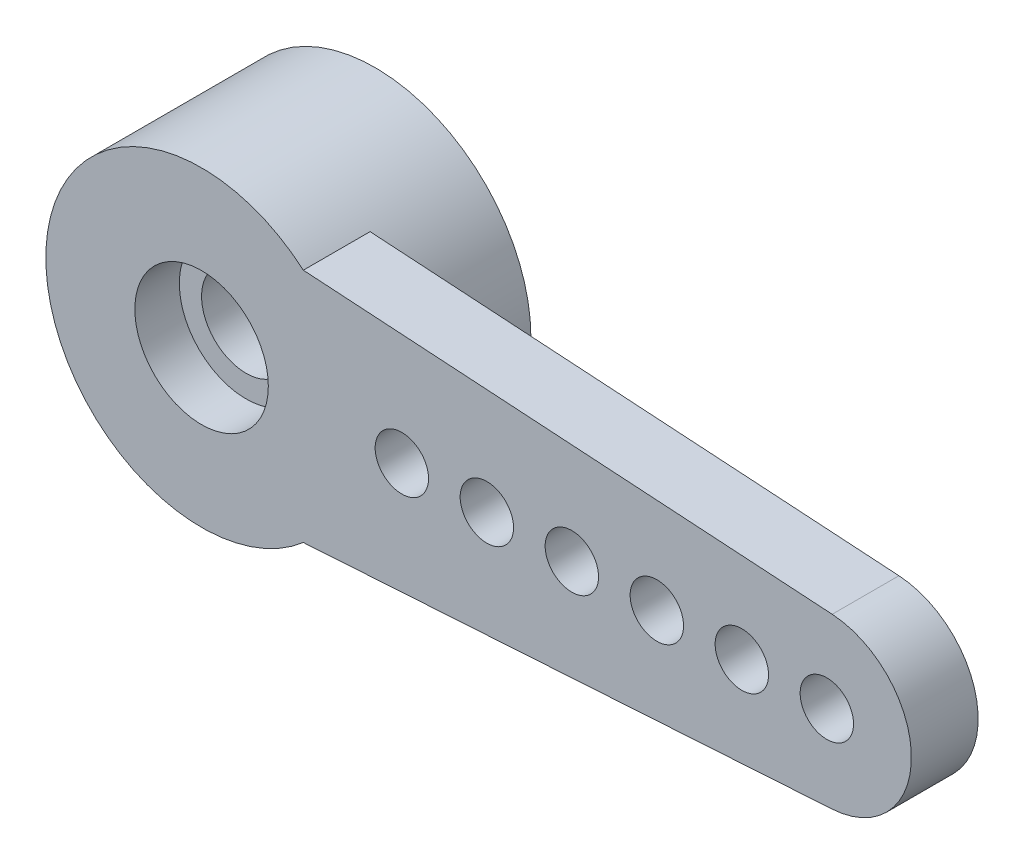
ISO-10303-21;
HEADER;
FILE_DESCRIPTION(('STEP AP214'),'2;1');
FILE_NAME('part.step','',(''),(''),'','','');
FILE_SCHEMA(('AUTOMOTIVE_DESIGN { 1 0 10303 214 1 1 1 1 }'));
ENDSEC;
DATA;
#1=APPLICATION_CONTEXT('core data for automotive mechanical design processes');
#2=APPLICATION_PROTOCOL_DEFINITION('international standard','automotive_design',2000,#1);
#3=PRODUCT_CONTEXT('',#1,'mechanical');
#4=PRODUCT('Part','Part','',(#3));
#5=PRODUCT_RELATED_PRODUCT_CATEGORY('part','',(#4));
#6=PRODUCT_DEFINITION_FORMATION('','',#4);
#7=PRODUCT_DEFINITION_CONTEXT('part definition',#1,'design');
#8=PRODUCT_DEFINITION('design','',#6,#7);
#9=PRODUCT_DEFINITION_SHAPE('','',#8);
#10=(LENGTH_UNIT() NAMED_UNIT(*) SI_UNIT(.MILLI.,.METRE.));
#11=(NAMED_UNIT(*) PLANE_ANGLE_UNIT() SI_UNIT($,.RADIAN.));
#12=(NAMED_UNIT(*) SI_UNIT($,.STERADIAN.) SOLID_ANGLE_UNIT());
#13=UNCERTAINTY_MEASURE_WITH_UNIT(LENGTH_MEASURE(1.E-05),#10,'distance_accuracy_value','');
#14=(GEOMETRIC_REPRESENTATION_CONTEXT(3) GLOBAL_UNCERTAINTY_ASSIGNED_CONTEXT((#13)) GLOBAL_UNIT_ASSIGNED_CONTEXT((#10,
#11,#12)) REPRESENTATION_CONTEXT('',''));
#15=CARTESIAN_POINT('',(0.,0.,0.));
#16=DIRECTION('',(0.,0.,1.));
#17=DIRECTION('',(1.,0.,0.));
#18=AXIS2_PLACEMENT_3D('',#15,#16,#17);
#19=CARTESIAN_POINT('',(0.,0.,3.9));
#20=DIRECTION('',(0.,0.,-1.));
#21=DIRECTION('',(-1.,0.,0.));
#22=AXIS2_PLACEMENT_3D('',#19,#20,#21);
#23=CYLINDRICAL_SURFACE('',#22,3.5);
#24=CARTESIAN_POINT('',(0.,0.,3.9));
#25=DIRECTION('',(0.,0.,1.));
#26=DIRECTION('',(1.,0.,0.));
#27=AXIS2_PLACEMENT_3D('',#24,#25,#26);
#28=CIRCLE('',#27,3.5);
#29=CARTESIAN_POINT('',(2.28637267303474,2.65,3.9));
#30=VERTEX_POINT('',#29);
#31=CARTESIAN_POINT('',(2.28637267303473,-2.65,3.9));
#32=VERTEX_POINT('',#31);
#33=EDGE_CURVE('E12',#30,#32,#28,.T.);
#34=ORIENTED_EDGE('',*,*,#33,.F.);
#35=DIRECTION('',(0.,0.,1.));
#36=VECTOR('',#35,1.);
#37=CARTESIAN_POINT('',(2.28637267303474,2.65,2.4));
#38=LINE('',#37,#36);
#39=CARTESIAN_POINT('',(2.28637267303474,2.65,2.4));
#40=VERTEX_POINT('',#39);
#41=EDGE_CURVE('E188',#40,#30,#38,.T.);
#42=ORIENTED_EDGE('',*,*,#41,.F.);
#43=CARTESIAN_POINT('',(0.,0.,2.4));
#44=DIRECTION('',(0.,0.,1.));
#45=DIRECTION('',(1.,0.,0.));
#46=AXIS2_PLACEMENT_3D('',#43,#44,#45);
#47=CIRCLE('',#46,3.5);
#48=CARTESIAN_POINT('',(2.28637267303473,-2.65,2.4));
#49=VERTEX_POINT('',#48);
#50=EDGE_CURVE('E174',#49,#40,#47,.T.);
#51=ORIENTED_EDGE('',*,*,#50,.F.);
#52=DIRECTION('',(0.,0.,1.));
#53=VECTOR('',#52,1.);
#54=CARTESIAN_POINT('',(2.28637267303473,-2.65,2.4));
#55=LINE('',#54,#53);
#56=EDGE_CURVE('E179',#49,#32,#55,.T.);
#57=ORIENTED_EDGE('',*,*,#56,.T.);
#58=EDGE_LOOP('',(#34,#42,#51,#57));
#59=FACE_BOUND('',#58,.T.);
#60=CARTESIAN_POINT('',(0.,0.,0.));
#61=DIRECTION('',(0.,0.,1.));
#62=DIRECTION('',(1.,0.,0.));
#63=AXIS2_PLACEMENT_3D('',#60,#61,#62);
#64=CIRCLE('',#63,3.5);
#65=CARTESIAN_POINT('',(3.5,0.,0.));
#66=VERTEX_POINT('',#65);
#67=EDGE_CURVE('E137',#66,#66,#64,.T.);
#68=ORIENTED_EDGE('',*,*,#67,.T.);
#69=EDGE_LOOP('',(#68));
#70=FACE_BOUND('',#69,.T.);
#71=ADVANCED_FACE('F129',(#59,#70),#23,.T.);
#72=CARTESIAN_POINT('',(0.,0.,3.9));
#73=DIRECTION('',(0.,0.,1.));
#74=DIRECTION('',(1.,0.,0.));
#75=AXIS2_PLACEMENT_3D('',#72,#73,#74);
#76=PLANE('',#75);
#77=CARTESIAN_POINT('',(0.,0.,3.9));
#78=DIRECTION('',(0.,0.,1.));
#79=DIRECTION('',(1.,0.,0.));
#80=AXIS2_PLACEMENT_3D('',#77,#78,#79);
#81=CIRCLE('',#80,1.5);
#82=CARTESIAN_POINT('',(1.5,0.,3.9));
#83=VERTEX_POINT('',#82);
#84=EDGE_CURVE('E482',#83,#83,#81,.T.);
#85=ORIENTED_EDGE('',*,*,#84,.F.);
#86=EDGE_LOOP('',(#85));
#87=FACE_BOUND('',#86,.T.);
#88=ORIENTED_EDGE('',*,*,#33,.T.);
#89=DIRECTION('',(0.99799428926586,0.0633040171926834,0.));
#90=VECTOR('',#89,1.);
#91=CARTESIAN_POINT('',(0.176581582893977,-2.78382666902983,3.9));
#92=LINE('',#91,#90);
#93=CARTESIAN_POINT('',(14.1702776326661,-1.89618914960513,3.9));
#94=VERTEX_POINT('',#93);
#95=EDGE_CURVE('E184',#32,#94,#92,.T.);
#96=ORIENTED_EDGE('',*,*,#95,.T.);
#97=CARTESIAN_POINT('',(14.05,0.,3.9));
#98=DIRECTION('',(0.,0.,1.));
#99=DIRECTION('',(1.,0.,0.));
#100=AXIS2_PLACEMENT_3D('',#97,#98,#99);
#101=CIRCLE('',#100,1.9);
#102=CARTESIAN_POINT('',(14.1702776326661,1.89618914960513,3.9));
#103=VERTEX_POINT('',#102);
#104=EDGE_CURVE('E197',#94,#103,#101,.T.);
#105=ORIENTED_EDGE('',*,*,#104,.T.);
#106=DIRECTION('',(-0.99799428926586,0.0633040171926833,0.));
#107=VECTOR('',#106,1.);
#108=CARTESIAN_POINT('',(0.176581582893976,2.78382666902983,3.9));
#109=LINE('',#108,#107);
#110=EDGE_CURVE('E144',#103,#30,#109,.T.);
#111=ORIENTED_EDGE('',*,*,#110,.T.);
#112=EDGE_LOOP('',(#88,#96,#105,#111));
#113=FACE_BOUND('',#112,.T.);
#114=CARTESIAN_POINT('',(14.05,0.,3.9));
#115=DIRECTION('',(0.,0.,1.));
#116=DIRECTION('',(1.,0.,0.));
#117=AXIS2_PLACEMENT_3D('',#114,#115,#116);
#118=CIRCLE('',#117,0.6);
#119=CARTESIAN_POINT('',(14.65,0.,3.9));
#120=VERTEX_POINT('',#119);
#121=EDGE_CURVE('E432',#120,#120,#118,.T.);
#122=ORIENTED_EDGE('',*,*,#121,.F.);
#123=EDGE_LOOP('',(#122));
#124=FACE_BOUND('',#123,.T.);
#125=CARTESIAN_POINT('',(12.14,0.,3.9));
#126=DIRECTION('',(0.,0.,1.));
#127=DIRECTION('',(1.,0.,0.));
#128=AXIS2_PLACEMENT_3D('',#125,#126,#127);
#129=CIRCLE('',#128,0.6);
#130=CARTESIAN_POINT('',(12.74,0.,3.9));
#131=VERTEX_POINT('',#130);
#132=EDGE_CURVE('E436',#131,#131,#129,.T.);
#133=ORIENTED_EDGE('',*,*,#132,.F.);
#134=EDGE_LOOP('',(#133));
#135=FACE_BOUND('',#134,.T.);
#136=CARTESIAN_POINT('',(10.23,0.,3.9));
#137=DIRECTION('',(0.,0.,1.));
#138=DIRECTION('',(1.,0.,0.));
#139=AXIS2_PLACEMENT_3D('',#136,#137,#138);
#140=CIRCLE('',#139,0.6);
#141=CARTESIAN_POINT('',(10.83,0.,3.9));
#142=VERTEX_POINT('',#141);
#143=EDGE_CURVE('E440',#142,#142,#140,.T.);
#144=ORIENTED_EDGE('',*,*,#143,.F.);
#145=EDGE_LOOP('',(#144));
#146=FACE_BOUND('',#145,.T.);
#147=CARTESIAN_POINT('',(8.32,0.,3.9));
#148=DIRECTION('',(0.,0.,1.));
#149=DIRECTION('',(1.,0.,0.));
#150=AXIS2_PLACEMENT_3D('',#147,#148,#149);
#151=CIRCLE('',#150,0.6);
#152=CARTESIAN_POINT('',(8.92,0.,3.9));
#153=VERTEX_POINT('',#152);
#154=EDGE_CURVE('E444',#153,#153,#151,.T.);
#155=ORIENTED_EDGE('',*,*,#154,.F.);
#156=EDGE_LOOP('',(#155));
#157=FACE_BOUND('',#156,.T.);
#158=CARTESIAN_POINT('',(6.41,0.,3.9));
#159=DIRECTION('',(0.,0.,1.));
#160=DIRECTION('',(1.,0.,0.));
#161=AXIS2_PLACEMENT_3D('',#158,#159,#160);
#162=CIRCLE('',#161,0.6);
#163=CARTESIAN_POINT('',(7.01,0.,3.9));
#164=VERTEX_POINT('',#163);
#165=EDGE_CURVE('E448',#164,#164,#162,.T.);
#166=ORIENTED_EDGE('',*,*,#165,.F.);
#167=EDGE_LOOP('',(#166));
#168=FACE_BOUND('',#167,.T.);
#169=CARTESIAN_POINT('',(4.5,0.,3.9));
#170=DIRECTION('',(0.,0.,1.));
#171=DIRECTION('',(1.,0.,0.));
#172=AXIS2_PLACEMENT_3D('',#169,#170,#171);
#173=CIRCLE('',#172,0.6);
#174=CARTESIAN_POINT('',(5.1,0.,3.9));
#175=VERTEX_POINT('',#174);
#176=EDGE_CURVE('E451',#175,#175,#173,.T.);
#177=ORIENTED_EDGE('',*,*,#176,.F.);
#178=EDGE_LOOP('',(#177));
#179=FACE_BOUND('',#178,.T.);
#180=ADVANCED_FACE('F214',(#87,#113,#124,#135,#146,#157,#168,#179),#76,.T.);
#181=CARTESIAN_POINT('',(0.,0.,0.));
#182=DIRECTION('',(0.,0.,1.));
#183=DIRECTION('',(1.,0.,0.));
#184=AXIS2_PLACEMENT_3D('',#181,#182,#183);
#185=PLANE('',#184);
#186=CARTESIAN_POINT('',(0.,0.,0.));
#187=DIRECTION('',(0.,0.,1.));
#188=DIRECTION('',(1.,0.,0.));
#189=AXIS2_PLACEMENT_3D('',#186,#187,#188);
#190=CIRCLE('',#189,2.5);
#191=CARTESIAN_POINT('',(2.5,0.,0.));
#192=VERTEX_POINT('',#191);
#193=EDGE_CURVE('E477',#192,#192,#190,.T.);
#194=ORIENTED_EDGE('',*,*,#193,.T.);
#195=EDGE_LOOP('',(#194));
#196=FACE_BOUND('',#195,.T.);
#197=ORIENTED_EDGE('',*,*,#67,.F.);
#198=EDGE_LOOP('',(#197));
#199=FACE_BOUND('',#198,.T.);
#200=ADVANCED_FACE('F211',(#196,#199),#185,.F.);
#201=CARTESIAN_POINT('',(0.176581582893976,2.78382666902983,2.4));
#202=DIRECTION('',(0.0633040171926833,0.99799428926586,0.));
#203=DIRECTION('',(-0.99799428926586,0.0633040171926833,0.));
#204=AXIS2_PLACEMENT_3D('',#201,#202,#203);
#205=PLANE('',#204);
#206=ORIENTED_EDGE('',*,*,#110,.F.);
#207=DIRECTION('',(0.,0.,1.));
#208=VECTOR('',#207,1.);
#209=CARTESIAN_POINT('',(14.1702776326661,1.89618914960513,2.4));
#210=LINE('',#209,#208);
#211=CARTESIAN_POINT('',(14.1702776326661,1.89618914960513,2.4));
#212=VERTEX_POINT('',#211);
#213=EDGE_CURVE('E152',#212,#103,#210,.T.);
#214=ORIENTED_EDGE('',*,*,#213,.F.);
#215=DIRECTION('',(-0.99799428926586,0.0633040171926833,0.));
#216=VECTOR('',#215,1.);
#217=CARTESIAN_POINT('',(0.176581582893976,2.78382666902983,2.4));
#218=LINE('',#217,#216);
#219=EDGE_CURVE('E195',#212,#40,#218,.T.);
#220=ORIENTED_EDGE('',*,*,#219,.T.);
#221=ORIENTED_EDGE('',*,*,#41,.T.);
#222=EDGE_LOOP('',(#206,#214,#220,#221));
#223=FACE_BOUND('',#222,.T.);
#224=ADVANCED_FACE('F213',(#223),#205,.T.);
#225=CARTESIAN_POINT('',(14.05,0.,2.4));
#226=DIRECTION('',(0.,0.,1.));
#227=DIRECTION('',(1.,0.,0.));
#228=AXIS2_PLACEMENT_3D('',#225,#226,#227);
#229=CYLINDRICAL_SURFACE('',#228,1.9);
#230=ORIENTED_EDGE('',*,*,#104,.F.);
#231=DIRECTION('',(0.,0.,1.));
#232=VECTOR('',#231,1.);
#233=CARTESIAN_POINT('',(14.1702776326661,-1.89618914960513,2.4));
#234=LINE('',#233,#232);
#235=CARTESIAN_POINT('',(14.1702776326661,-1.89618914960513,2.4));
#236=VERTEX_POINT('',#235);
#237=EDGE_CURVE('E187',#236,#94,#234,.T.);
#238=ORIENTED_EDGE('',*,*,#237,.F.);
#239=CARTESIAN_POINT('',(14.05,0.,2.4));
#240=DIRECTION('',(0.,0.,1.));
#241=DIRECTION('',(1.,0.,0.));
#242=AXIS2_PLACEMENT_3D('',#239,#240,#241);
#243=CIRCLE('',#242,1.9);
#244=EDGE_CURVE('E191',#236,#212,#243,.T.);
#245=ORIENTED_EDGE('',*,*,#244,.T.);
#246=ORIENTED_EDGE('',*,*,#213,.T.);
#247=EDGE_LOOP('',(#230,#238,#245,#246));
#248=FACE_BOUND('',#247,.T.);
#249=ADVANCED_FACE('F220',(#248),#229,.T.);
#250=CARTESIAN_POINT('',(0.176581582893977,-2.78382666902983,2.4));
#251=DIRECTION('',(0.0633040171926833,-0.99799428926586,0.));
#252=DIRECTION('',(0.99799428926586,0.0633040171926834,0.));
#253=AXIS2_PLACEMENT_3D('',#250,#251,#252);
#254=PLANE('',#253);
#255=ORIENTED_EDGE('',*,*,#95,.F.);
#256=ORIENTED_EDGE('',*,*,#56,.F.);
#257=DIRECTION('',(0.99799428926586,0.0633040171926834,0.));
#258=VECTOR('',#257,1.);
#259=CARTESIAN_POINT('',(0.176581582893977,-2.78382666902983,2.4));
#260=LINE('',#259,#258);
#261=EDGE_CURVE('E181',#49,#236,#260,.T.);
#262=ORIENTED_EDGE('',*,*,#261,.T.);
#263=ORIENTED_EDGE('',*,*,#237,.T.);
#264=EDGE_LOOP('',(#255,#256,#262,#263));
#265=FACE_BOUND('',#264,.T.);
#266=ADVANCED_FACE('F180',(#265),#254,.T.);
#267=CARTESIAN_POINT('',(0.,0.,2.4));
#268=DIRECTION('',(0.,0.,1.));
#269=DIRECTION('',(1.,0.,0.));
#270=AXIS2_PLACEMENT_3D('',#267,#268,#269);
#271=PLANE('',#270);
#272=CARTESIAN_POINT('',(14.05,0.,2.4));
#273=DIRECTION('',(0.,0.,1.));
#274=DIRECTION('',(1.,0.,0.));
#275=AXIS2_PLACEMENT_3D('',#272,#273,#274);
#276=CIRCLE('',#275,0.6);
#277=CARTESIAN_POINT('',(14.65,0.,2.4));
#278=VERTEX_POINT('',#277);
#279=EDGE_CURVE('E470',#278,#278,#276,.T.);
#280=ORIENTED_EDGE('',*,*,#279,.T.);
#281=EDGE_LOOP('',(#280));
#282=FACE_BOUND('',#281,.T.);
#283=CARTESIAN_POINT('',(12.14,0.,2.4));
#284=DIRECTION('',(0.,0.,1.));
#285=DIRECTION('',(1.,0.,0.));
#286=AXIS2_PLACEMENT_3D('',#283,#284,#285);
#287=CIRCLE('',#286,0.6);
#288=CARTESIAN_POINT('',(12.74,0.,2.4));
#289=VERTEX_POINT('',#288);
#290=EDGE_CURVE('E466',#289,#289,#287,.T.);
#291=ORIENTED_EDGE('',*,*,#290,.T.);
#292=EDGE_LOOP('',(#291));
#293=FACE_BOUND('',#292,.T.);
#294=CARTESIAN_POINT('',(10.23,0.,2.4));
#295=DIRECTION('',(0.,0.,1.));
#296=DIRECTION('',(1.,0.,0.));
#297=AXIS2_PLACEMENT_3D('',#294,#295,#296);
#298=CIRCLE('',#297,0.6);
#299=CARTESIAN_POINT('',(10.83,0.,2.4));
#300=VERTEX_POINT('',#299);
#301=EDGE_CURVE('E462',#300,#300,#298,.T.);
#302=ORIENTED_EDGE('',*,*,#301,.T.);
#303=EDGE_LOOP('',(#302));
#304=FACE_BOUND('',#303,.T.);
#305=CARTESIAN_POINT('',(8.32,0.,2.4));
#306=DIRECTION('',(0.,0.,1.));
#307=DIRECTION('',(1.,0.,0.));
#308=AXIS2_PLACEMENT_3D('',#305,#306,#307);
#309=CIRCLE('',#308,0.6);
#310=CARTESIAN_POINT('',(8.92,0.,2.4));
#311=VERTEX_POINT('',#310);
#312=EDGE_CURVE('E459',#311,#311,#309,.T.);
#313=ORIENTED_EDGE('',*,*,#312,.T.);
#314=EDGE_LOOP('',(#313));
#315=FACE_BOUND('',#314,.T.);
#316=CARTESIAN_POINT('',(6.41,0.,2.4));
#317=DIRECTION('',(0.,0.,1.));
#318=DIRECTION('',(1.,0.,0.));
#319=AXIS2_PLACEMENT_3D('',#316,#317,#318);
#320=CIRCLE('',#319,0.6);
#321=CARTESIAN_POINT('',(7.01,0.,2.4));
#322=VERTEX_POINT('',#321);
#323=EDGE_CURVE('E453',#322,#322,#320,.T.);
#324=ORIENTED_EDGE('',*,*,#323,.T.);
#325=EDGE_LOOP('',(#324));
#326=FACE_BOUND('',#325,.T.);
#327=CARTESIAN_POINT('',(4.5,0.,2.4));
#328=DIRECTION('',(0.,0.,1.));
#329=DIRECTION('',(1.,0.,0.));
#330=AXIS2_PLACEMENT_3D('',#327,#328,#329);
#331=CIRCLE('',#330,0.6);
#332=CARTESIAN_POINT('',(5.1,0.,2.4));
#333=VERTEX_POINT('',#332);
#334=EDGE_CURVE('E203',#333,#333,#331,.T.);
#335=ORIENTED_EDGE('',*,*,#334,.T.);
#336=EDGE_LOOP('',(#335));
#337=FACE_BOUND('',#336,.T.);
#338=ORIENTED_EDGE('',*,*,#219,.F.);
#339=ORIENTED_EDGE('',*,*,#244,.F.);
#340=ORIENTED_EDGE('',*,*,#261,.F.);
#341=ORIENTED_EDGE('',*,*,#50,.T.);
#342=EDGE_LOOP('',(#338,#339,#340,#341));
#343=FACE_BOUND('',#342,.T.);
#344=ADVANCED_FACE('F190',(#282,#293,#304,#315,#326,#337,#343),#271,.F.);
#345=CARTESIAN_POINT('',(4.5,0.,2.4));
#346=DIRECTION('',(0.,0.,1.));
#347=DIRECTION('',(1.,0.,0.));
#348=AXIS2_PLACEMENT_3D('',#345,#346,#347);
#349=CYLINDRICAL_SURFACE('',#348,0.6);
#350=ORIENTED_EDGE('',*,*,#334,.F.);
#351=EDGE_LOOP('',(#350));
#352=FACE_BOUND('',#351,.T.);
#353=ORIENTED_EDGE('',*,*,#176,.T.);
#354=EDGE_LOOP('',(#353));
#355=FACE_BOUND('',#354,.T.);
#356=ADVANCED_FACE('F344',(#352,#355),#349,.F.);
#357=CARTESIAN_POINT('',(6.41,0.,2.4));
#358=DIRECTION('',(0.,0.,1.));
#359=DIRECTION('',(1.,0.,0.));
#360=AXIS2_PLACEMENT_3D('',#357,#358,#359);
#361=CYLINDRICAL_SURFACE('',#360,0.6);
#362=ORIENTED_EDGE('',*,*,#323,.F.);
#363=EDGE_LOOP('',(#362));
#364=FACE_BOUND('',#363,.T.);
#365=ORIENTED_EDGE('',*,*,#165,.T.);
#366=EDGE_LOOP('',(#365));
#367=FACE_BOUND('',#366,.T.);
#368=ADVANCED_FACE('F334',(#364,#367),#361,.F.);
#369=CARTESIAN_POINT('',(8.32,0.,2.4));
#370=DIRECTION('',(0.,0.,1.));
#371=DIRECTION('',(1.,0.,0.));
#372=AXIS2_PLACEMENT_3D('',#369,#370,#371);
#373=CYLINDRICAL_SURFACE('',#372,0.6);
#374=ORIENTED_EDGE('',*,*,#312,.F.);
#375=EDGE_LOOP('',(#374));
#376=FACE_BOUND('',#375,.T.);
#377=ORIENTED_EDGE('',*,*,#154,.T.);
#378=EDGE_LOOP('',(#377));
#379=FACE_BOUND('',#378,.T.);
#380=ADVANCED_FACE('F324',(#376,#379),#373,.F.);
#381=CARTESIAN_POINT('',(10.23,0.,2.4));
#382=DIRECTION('',(0.,0.,1.));
#383=DIRECTION('',(1.,0.,0.));
#384=AXIS2_PLACEMENT_3D('',#381,#382,#383);
#385=CYLINDRICAL_SURFACE('',#384,0.6);
#386=ORIENTED_EDGE('',*,*,#301,.F.);
#387=EDGE_LOOP('',(#386));
#388=FACE_BOUND('',#387,.T.);
#389=ORIENTED_EDGE('',*,*,#143,.T.);
#390=EDGE_LOOP('',(#389));
#391=FACE_BOUND('',#390,.T.);
#392=ADVANCED_FACE('F314',(#388,#391),#385,.F.);
#393=CARTESIAN_POINT('',(12.14,0.,2.4));
#394=DIRECTION('',(0.,0.,1.));
#395=DIRECTION('',(1.,0.,0.));
#396=AXIS2_PLACEMENT_3D('',#393,#394,#395);
#397=CYLINDRICAL_SURFACE('',#396,0.6);
#398=ORIENTED_EDGE('',*,*,#290,.F.);
#399=EDGE_LOOP('',(#398));
#400=FACE_BOUND('',#399,.T.);
#401=ORIENTED_EDGE('',*,*,#132,.T.);
#402=EDGE_LOOP('',(#401));
#403=FACE_BOUND('',#402,.T.);
#404=ADVANCED_FACE('F304',(#400,#403),#397,.F.);
#405=CARTESIAN_POINT('',(14.05,0.,2.4));
#406=DIRECTION('',(0.,0.,1.));
#407=DIRECTION('',(1.,0.,0.));
#408=AXIS2_PLACEMENT_3D('',#405,#406,#407);
#409=CYLINDRICAL_SURFACE('',#408,0.6);
#410=ORIENTED_EDGE('',*,*,#279,.F.);
#411=EDGE_LOOP('',(#410));
#412=FACE_BOUND('',#411,.T.);
#413=ORIENTED_EDGE('',*,*,#121,.T.);
#414=EDGE_LOOP('',(#413));
#415=FACE_BOUND('',#414,.T.);
#416=ADVANCED_FACE('F295',(#412,#415),#409,.F.);
#417=CARTESIAN_POINT('',(0.,0.,2.));
#418=DIRECTION('',(0.,0.,-1.));
#419=DIRECTION('',(-1.,0.,0.));
#420=AXIS2_PLACEMENT_3D('',#417,#418,#419);
#421=CYLINDRICAL_SURFACE('',#420,2.5);
#422=CARTESIAN_POINT('',(0.,0.,2.));
#423=DIRECTION('',(0.,0.,1.));
#424=DIRECTION('',(1.,0.,0.));
#425=AXIS2_PLACEMENT_3D('',#422,#423,#424);
#426=CIRCLE('',#425,2.5);
#427=CARTESIAN_POINT('',(2.5,0.,2.));
#428=VERTEX_POINT('',#427);
#429=EDGE_CURVE('E474',#428,#428,#426,.T.);
#430=ORIENTED_EDGE('',*,*,#429,.T.);
#431=EDGE_LOOP('',(#430));
#432=FACE_BOUND('',#431,.T.);
#433=ORIENTED_EDGE('',*,*,#193,.F.);
#434=EDGE_LOOP('',(#433));
#435=FACE_BOUND('',#434,.T.);
#436=ADVANCED_FACE('F241',(#432,#435),#421,.F.);
#437=CARTESIAN_POINT('',(0.,0.,2.));
#438=DIRECTION('',(0.,0.,1.));
#439=DIRECTION('',(1.,0.,0.));
#440=AXIS2_PLACEMENT_3D('',#437,#438,#439);
#441=PLANE('',#440);
#442=CARTESIAN_POINT('',(0.,0.,2.));
#443=DIRECTION('',(0.,0.,1.));
#444=DIRECTION('',(1.,0.,0.));
#445=AXIS2_PLACEMENT_3D('',#442,#443,#444);
#446=CIRCLE('',#445,1.);
#447=CARTESIAN_POINT('',(1.,0.,2.));
#448=VERTEX_POINT('',#447);
#449=EDGE_CURVE('E485',#448,#448,#446,.F.);
#450=ORIENTED_EDGE('',*,*,#449,.F.);
#451=EDGE_LOOP('',(#450));
#452=FACE_BOUND('',#451,.T.);
#453=ORIENTED_EDGE('',*,*,#429,.F.);
#454=EDGE_LOOP('',(#453));
#455=FACE_BOUND('',#454,.T.);
#456=ADVANCED_FACE('F251',(#452,#455),#441,.F.);
#457=CARTESIAN_POINT('',(0.,0.,2.9));
#458=DIRECTION('',(0.,0.,1.));
#459=DIRECTION('',(1.,0.,0.));
#460=AXIS2_PLACEMENT_3D('',#457,#458,#459);
#461=CYLINDRICAL_SURFACE('',#460,1.5);
#462=CARTESIAN_POINT('',(0.,0.,2.9));
#463=DIRECTION('',(0.,0.,1.));
#464=DIRECTION('',(1.,0.,0.));
#465=AXIS2_PLACEMENT_3D('',#462,#463,#464);
#466=CIRCLE('',#465,1.5);
#467=CARTESIAN_POINT('',(1.5,0.,2.9));
#468=VERTEX_POINT('',#467);
#469=EDGE_CURVE('E479',#468,#468,#466,.T.);
#470=ORIENTED_EDGE('',*,*,#469,.F.);
#471=EDGE_LOOP('',(#470));
#472=FACE_BOUND('',#471,.T.);
#473=ORIENTED_EDGE('',*,*,#84,.T.);
#474=EDGE_LOOP('',(#473));
#475=FACE_BOUND('',#474,.T.);
#476=ADVANCED_FACE('F245',(#472,#475),#461,.F.);
#477=CARTESIAN_POINT('',(0.,0.,2.9));
#478=DIRECTION('',(0.,0.,1.));
#479=DIRECTION('',(1.,0.,0.));
#480=AXIS2_PLACEMENT_3D('',#477,#478,#479);
#481=PLANE('',#480);
#482=CARTESIAN_POINT('',(0.,0.,2.9));
#483=DIRECTION('',(0.,0.,1.));
#484=DIRECTION('',(1.,0.,0.));
#485=AXIS2_PLACEMENT_3D('',#482,#483,#484);
#486=CIRCLE('',#485,1.);
#487=CARTESIAN_POINT('',(1.,0.,2.9));
#488=VERTEX_POINT('',#487);
#489=EDGE_CURVE('E132',#488,#488,#486,.F.);
#490=ORIENTED_EDGE('',*,*,#489,.T.);
#491=EDGE_LOOP('',(#490));
#492=FACE_BOUND('',#491,.T.);
#493=ORIENTED_EDGE('',*,*,#469,.T.);
#494=EDGE_LOOP('',(#493));
#495=FACE_BOUND('',#494,.T.);
#496=ADVANCED_FACE('F250',(#492,#495),#481,.T.);
#497=CARTESIAN_POINT('',(0.,0.,3.9));
#498=DIRECTION('',(0.,0.,-1.));
#499=DIRECTION('',(-1.,0.,0.));
#500=AXIS2_PLACEMENT_3D('',#497,#498,#499);
#501=CYLINDRICAL_SURFACE('',#500,1.);
#502=ORIENTED_EDGE('',*,*,#489,.F.);
#503=EDGE_LOOP('',(#502));
#504=FACE_BOUND('',#503,.T.);
#505=ORIENTED_EDGE('',*,*,#449,.T.);
#506=EDGE_LOOP('',(#505));
#507=FACE_BOUND('',#506,.T.);
#508=ADVANCED_FACE('F272',(#504,#507),#501,.F.);
#509=CLOSED_SHELL('',(#71,#180,#200,#224,#249,#266,#344,#356,#368,#380,#392,#404,#416,#436,#456,
#476,#496,#508));
#510=MANIFOLD_SOLID_BREP('B2',#509);
#511=ADVANCED_BREP_SHAPE_REPRESENTATION('',(#18,#510),#14);
#512=SHAPE_DEFINITION_REPRESENTATION(#9,#511);
ENDSEC;
END-ISO-10303-21;
